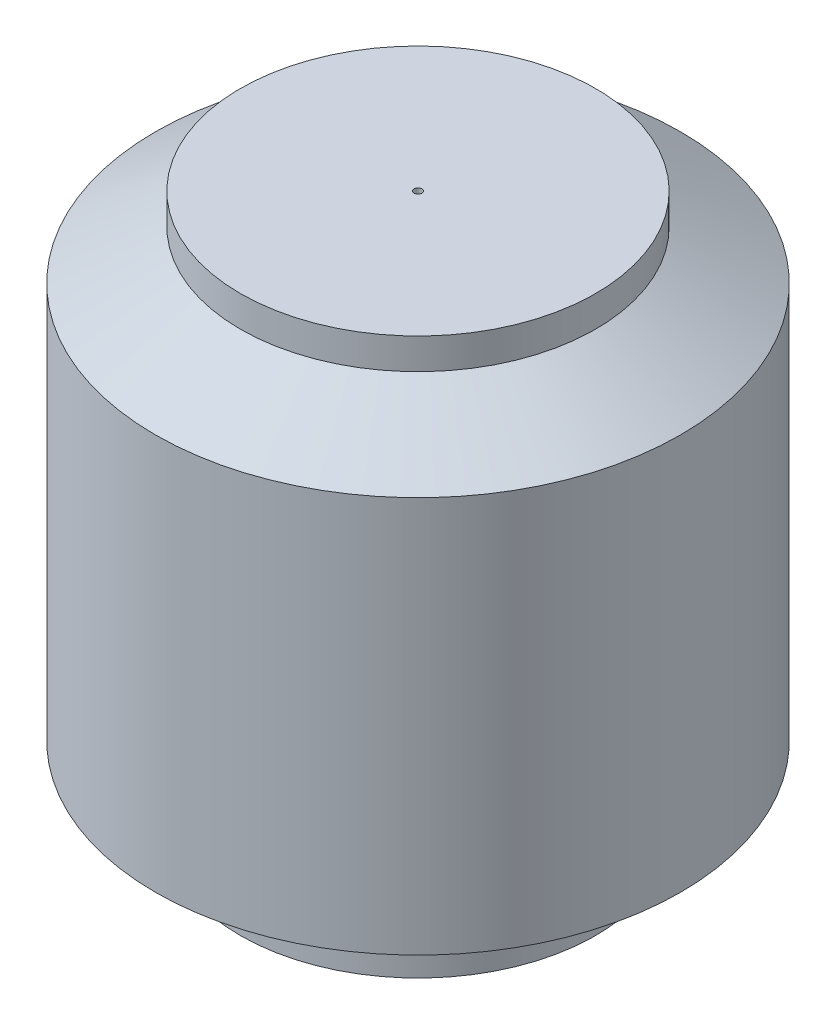
ISO-10303-21;
HEADER;
FILE_DESCRIPTION(('STEP AP214'),'2;1');
FILE_NAME('part.step','',(''),(''),'','','');
FILE_SCHEMA(('AUTOMOTIVE_DESIGN { 1 0 10303 214 1 1 1 1 }'));
ENDSEC;
DATA;
#1=APPLICATION_CONTEXT('core data for automotive mechanical design processes');
#2=APPLICATION_PROTOCOL_DEFINITION('international standard','automotive_design',2000,#1);
#3=PRODUCT_CONTEXT('',#1,'mechanical');
#4=PRODUCT('Part','Part','',(#3));
#5=PRODUCT_RELATED_PRODUCT_CATEGORY('part','',(#4));
#6=PRODUCT_DEFINITION_FORMATION('','',#4);
#7=PRODUCT_DEFINITION_CONTEXT('part definition',#1,'design');
#8=PRODUCT_DEFINITION('design','',#6,#7);
#9=PRODUCT_DEFINITION_SHAPE('','',#8);
#10=(LENGTH_UNIT() NAMED_UNIT(*) SI_UNIT(.MILLI.,.METRE.));
#11=(NAMED_UNIT(*) PLANE_ANGLE_UNIT() SI_UNIT($,.RADIAN.));
#12=(NAMED_UNIT(*) SI_UNIT($,.STERADIAN.) SOLID_ANGLE_UNIT());
#13=UNCERTAINTY_MEASURE_WITH_UNIT(LENGTH_MEASURE(1.E-05),#10,'distance_accuracy_value','');
#14=(GEOMETRIC_REPRESENTATION_CONTEXT(3) GLOBAL_UNCERTAINTY_ASSIGNED_CONTEXT((#13)) GLOBAL_UNIT_ASSIGNED_CONTEXT((#10,
#11,#12)) REPRESENTATION_CONTEXT('',''));
#15=CARTESIAN_POINT('',(0.,0.,0.));
#16=DIRECTION('',(0.,0.,1.));
#17=DIRECTION('',(1.,0.,0.));
#18=AXIS2_PLACEMENT_3D('',#15,#16,#17);
#19=CARTESIAN_POINT('',(0.,0.,0.));
#20=DIRECTION('',(0.,1.,0.));
#21=DIRECTION('',(0.,0.,1.));
#22=AXIS2_PLACEMENT_3D('',#19,#20,#21);
#23=PLANE('',#22);
#24=CARTESIAN_POINT('',(0.,0.,0.));
#25=DIRECTION('',(0.,1.,0.));
#26=DIRECTION('',(0.,0.,1.));
#27=AXIS2_PLACEMENT_3D('',#24,#25,#26);
#28=CIRCLE('',#27,1.25);
#29=CARTESIAN_POINT('',(0.,0.,1.25));
#30=VERTEX_POINT('',#29);
#31=EDGE_CURVE('E62',#30,#30,#28,.T.);
#32=ORIENTED_EDGE('',*,*,#31,.F.);
#33=EDGE_LOOP('',(#32));
#34=FACE_BOUND('',#33,.T.);
#35=CARTESIAN_POINT('',(0.,0.,0.));
#36=DIRECTION('',(0.,1.,0.));
#37=DIRECTION('',(0.,0.,1.));
#38=AXIS2_PLACEMENT_3D('',#35,#36,#37);
#39=CIRCLE('',#38,57.5);
#40=CARTESIAN_POINT('',(0.,0.,57.5));
#41=VERTEX_POINT('',#40);
#42=EDGE_CURVE('E41',#41,#41,#39,.T.);
#43=ORIENTED_EDGE('',*,*,#42,.T.);
#44=EDGE_LOOP('',(#43));
#45=FACE_BOUND('',#44,.T.);
#46=ADVANCED_FACE('F30',(#34,#45),#23,.T.);
#47=CARTESIAN_POINT('',(0.,52.509012345679,0.));
#48=DIRECTION('',(0.,1.,0.));
#49=DIRECTION('',(0.,0.,1.));
#50=AXIS2_PLACEMENT_3D('',#47,#48,#49);
#51=CYLINDRICAL_SURFACE('',#50,57.5);
#52=CARTESIAN_POINT('',(0.,-9.99999999999997,0.));
#53=DIRECTION('',(0.,1.,0.));
#54=DIRECTION('',(0.,0.,1.));
#55=AXIS2_PLACEMENT_3D('',#52,#53,#54);
#56=CIRCLE('',#55,57.5);
#57=CARTESIAN_POINT('',(0.,-9.99999999999997,57.5));
#58=VERTEX_POINT('',#57);
#59=EDGE_CURVE('E45',#58,#58,#56,.T.);
#60=ORIENTED_EDGE('',*,*,#59,.T.);
#61=EDGE_LOOP('',(#60));
#62=FACE_BOUND('',#61,.T.);
#63=ORIENTED_EDGE('',*,*,#42,.F.);
#64=EDGE_LOOP('',(#63));
#65=FACE_BOUND('',#64,.T.);
#66=ADVANCED_FACE('F70',(#62,#65),#51,.T.);
#67=CARTESIAN_POINT('',(0.,-9.99999999999997,0.));
#68=DIRECTION('',(0.,-1.,0.));
#69=DIRECTION('',(0.,0.,-1.));
#70=AXIS2_PLACEMENT_3D('',#67,#68,#69);
#71=CONICAL_SURFACE('',#70,57.5,1.0471975511966);
#72=CARTESIAN_POINT('',(0.,-25.8771324027146,0.));
#73=DIRECTION('',(0.,1.,0.));
#74=DIRECTION('',(0.,0.,1.));
#75=AXIS2_PLACEMENT_3D('',#72,#73,#74);
#76=CIRCLE('',#75,85.);
#77=CARTESIAN_POINT('',(0.,-25.8771324027146,85.));
#78=VERTEX_POINT('',#77);
#79=EDGE_CURVE('E50',#78,#78,#76,.T.);
#80=ORIENTED_EDGE('',*,*,#79,.T.);
#81=EDGE_LOOP('',(#80));
#82=FACE_BOUND('',#81,.T.);
#83=ORIENTED_EDGE('',*,*,#59,.F.);
#84=EDGE_LOOP('',(#83));
#85=FACE_BOUND('',#84,.T.);
#86=ADVANCED_FACE('F74',(#82,#85),#71,.T.);
#87=CARTESIAN_POINT('',(0.,52.509012345679,0.));
#88=DIRECTION('',(0.,1.,0.));
#89=DIRECTION('',(0.,0.,1.));
#90=AXIS2_PLACEMENT_3D('',#87,#88,#89);
#91=CYLINDRICAL_SURFACE('',#90,85.);
#92=CARTESIAN_POINT('',(0.,-154.122867597285,0.));
#93=DIRECTION('',(0.,1.,0.));
#94=DIRECTION('',(0.,0.,1.));
#95=AXIS2_PLACEMENT_3D('',#92,#93,#94);
#96=CIRCLE('',#95,85.);
#97=CARTESIAN_POINT('',(0.,-154.122867597285,85.));
#98=VERTEX_POINT('',#97);
#99=EDGE_CURVE('E53',#98,#98,#96,.T.);
#100=ORIENTED_EDGE('',*,*,#99,.T.);
#101=EDGE_LOOP('',(#100));
#102=FACE_BOUND('',#101,.T.);
#103=ORIENTED_EDGE('',*,*,#79,.F.);
#104=EDGE_LOOP('',(#103));
#105=FACE_BOUND('',#104,.T.);
#106=ADVANCED_FACE('F80',(#102,#105),#91,.T.);
#107=CARTESIAN_POINT('',(0.,-154.122867597285,0.));
#108=DIRECTION('',(0.,1.,0.));
#109=DIRECTION('',(0.,0.,1.));
#110=AXIS2_PLACEMENT_3D('',#107,#108,#109);
#111=CONICAL_SURFACE('',#110,85.,1.0471975511966);
#112=CARTESIAN_POINT('',(0.,-170.,0.));
#113=DIRECTION('',(0.,1.,0.));
#114=DIRECTION('',(0.,0.,1.));
#115=AXIS2_PLACEMENT_3D('',#112,#113,#114);
#116=CIRCLE('',#115,57.5);
#117=CARTESIAN_POINT('',(0.,-170.,57.5));
#118=VERTEX_POINT('',#117);
#119=EDGE_CURVE('E56',#118,#118,#116,.T.);
#120=ORIENTED_EDGE('',*,*,#119,.T.);
#121=EDGE_LOOP('',(#120));
#122=FACE_BOUND('',#121,.T.);
#123=ORIENTED_EDGE('',*,*,#99,.F.);
#124=EDGE_LOOP('',(#123));
#125=FACE_BOUND('',#124,.T.);
#126=ADVANCED_FACE('F86',(#122,#125),#111,.T.);
#127=CARTESIAN_POINT('',(0.,52.509012345679,0.));
#128=DIRECTION('',(0.,1.,0.));
#129=DIRECTION('',(0.,0.,1.));
#130=AXIS2_PLACEMENT_3D('',#127,#128,#129);
#131=CYLINDRICAL_SURFACE('',#130,57.5);
#132=CARTESIAN_POINT('',(0.,-180.,0.));
#133=DIRECTION('',(0.,1.,0.));
#134=DIRECTION('',(0.,0.,1.));
#135=AXIS2_PLACEMENT_3D('',#132,#133,#134);
#136=CIRCLE('',#135,57.5);
#137=CARTESIAN_POINT('',(0.,-180.,57.5));
#138=VERTEX_POINT('',#137);
#139=EDGE_CURVE('E59',#138,#138,#136,.T.);
#140=ORIENTED_EDGE('',*,*,#139,.T.);
#141=EDGE_LOOP('',(#140));
#142=FACE_BOUND('',#141,.T.);
#143=ORIENTED_EDGE('',*,*,#119,.F.);
#144=EDGE_LOOP('',(#143));
#145=FACE_BOUND('',#144,.T.);
#146=ADVANCED_FACE('F90',(#142,#145),#131,.T.);
#147=CARTESIAN_POINT('',(-57.5,-180.,0.));
#148=DIRECTION('',(0.,-1.,0.));
#149=DIRECTION('',(0.,0.,-1.));
#150=AXIS2_PLACEMENT_3D('',#147,#148,#149);
#151=PLANE('',#150);
#152=CARTESIAN_POINT('',(0.,-180.,0.));
#153=DIRECTION('',(0.,-1.,0.));
#154=DIRECTION('',(0.,0.,-1.));
#155=AXIS2_PLACEMENT_3D('',#152,#153,#154);
#156=CIRCLE('',#155,3.24999999999984);
#157=CARTESIAN_POINT('',(0.,-180.,-3.24999999999984));
#158=VERTEX_POINT('',#157);
#159=EDGE_CURVE('E37',#158,#158,#156,.F.);
#160=ORIENTED_EDGE('',*,*,#159,.T.);
#161=EDGE_LOOP('',(#160));
#162=FACE_BOUND('',#161,.T.);
#163=ORIENTED_EDGE('',*,*,#139,.F.);
#164=EDGE_LOOP('',(#163));
#165=FACE_BOUND('',#164,.T.);
#166=ADVANCED_FACE('F94',(#162,#165),#151,.T.);
#167=CARTESIAN_POINT('',(0.,-180.,0.));
#168=DIRECTION('',(0.,1.,0.));
#169=DIRECTION('',(0.,0.,1.));
#170=AXIS2_PLACEMENT_3D('',#167,#168,#169);
#171=CYLINDRICAL_SURFACE('',#170,1.25);
#172=CARTESIAN_POINT('',(0.,-178.,0.));
#173=DIRECTION('',(0.,-1.,0.));
#174=DIRECTION('',(0.,0.,-1.));
#175=AXIS2_PLACEMENT_3D('',#172,#173,#174);
#176=CIRCLE('',#175,1.25);
#177=CARTESIAN_POINT('',(0.,-178.,1.25));
#178=VERTEX_POINT('',#177);
#179=EDGE_CURVE('E10',#178,#178,#176,.T.);
#180=CARTESIAN_POINT('',(0.,-178.,1.25));
#181=CARTESIAN_POINT('',(0.,-176.145833333333,1.25));
#182=CARTESIAN_POINT('',(0.,-174.291666666667,1.25));
#183=CARTESIAN_POINT('',(0.,-170.583333333333,1.25));
#184=CARTESIAN_POINT('',(0.,-168.729166666667,1.25));
#185=CARTESIAN_POINT('',(0.,-165.020833333333,1.25));
#186=CARTESIAN_POINT('',(0.,-163.166666666667,1.25));
#187=CARTESIAN_POINT('',(0.,-159.458333333333,1.25));
#188=CARTESIAN_POINT('',(0.,-157.604166666667,1.25));
#189=CARTESIAN_POINT('',(0.,-153.895833333333,1.25));
#190=CARTESIAN_POINT('',(0.,-152.041666666667,1.25));
#191=CARTESIAN_POINT('',(0.,-148.333333333333,1.25));
#192=CARTESIAN_POINT('',(0.,-146.479166666667,1.25));
#193=CARTESIAN_POINT('',(0.,-142.770833333333,1.25));
#194=CARTESIAN_POINT('',(0.,-140.916666666667,1.25));
#195=CARTESIAN_POINT('',(0.,-137.208333333333,1.25));
#196=CARTESIAN_POINT('',(0.,-135.354166666667,1.25));
#197=CARTESIAN_POINT('',(0.,-131.645833333333,1.25));
#198=CARTESIAN_POINT('',(0.,-129.791666666667,1.25));
#199=CARTESIAN_POINT('',(0.,-126.083333333333,1.25));
#200=CARTESIAN_POINT('',(0.,-124.229166666667,1.25));
#201=CARTESIAN_POINT('',(0.,-120.520833333333,1.25));
#202=CARTESIAN_POINT('',(0.,-118.666666666667,1.25));
#203=CARTESIAN_POINT('',(0.,-114.958333333333,1.25));
#204=CARTESIAN_POINT('',(0.,-113.104166666667,1.25));
#205=CARTESIAN_POINT('',(0.,-109.395833333333,1.25));
#206=CARTESIAN_POINT('',(0.,-107.541666666667,1.25));
#207=CARTESIAN_POINT('',(0.,-103.833333333333,1.25));
#208=CARTESIAN_POINT('',(0.,-101.979166666667,1.25));
#209=CARTESIAN_POINT('',(0.,-98.2708333333334,1.25));
#210=CARTESIAN_POINT('',(0.,-96.4166666666667,1.25));
#211=CARTESIAN_POINT('',(0.,-92.7083333333334,1.25));
#212=CARTESIAN_POINT('',(0.,-90.8541666666667,1.25));
#213=CARTESIAN_POINT('',(0.,-87.1458333333334,1.25));
#214=CARTESIAN_POINT('',(0.,-85.2916666666667,1.25));
#215=CARTESIAN_POINT('',(0.,-81.5833333333334,1.25));
#216=CARTESIAN_POINT('',(0.,-79.7291666666667,1.25));
#217=CARTESIAN_POINT('',(0.,-76.0208333333334,1.25));
#218=CARTESIAN_POINT('',(0.,-74.1666666666667,1.25));
#219=CARTESIAN_POINT('',(0.,-70.4583333333334,1.25));
#220=CARTESIAN_POINT('',(0.,-68.6041666666667,1.25));
#221=CARTESIAN_POINT('',(0.,-64.8958333333333,1.25));
#222=CARTESIAN_POINT('',(0.,-63.0416666666667,1.25));
#223=CARTESIAN_POINT('',(0.,-59.3333333333333,1.25));
#224=CARTESIAN_POINT('',(0.,-57.4791666666667,1.25));
#225=CARTESIAN_POINT('',(0.,-53.7708333333333,1.25));
#226=CARTESIAN_POINT('',(0.,-51.9166666666667,1.25));
#227=CARTESIAN_POINT('',(0.,-48.2083333333333,1.25));
#228=CARTESIAN_POINT('',(0.,-46.3541666666667,1.25));
#229=CARTESIAN_POINT('',(0.,-42.6458333333333,1.25));
#230=CARTESIAN_POINT('',(0.,-40.7916666666667,1.25));
#231=CARTESIAN_POINT('',(0.,-37.0833333333333,1.25));
#232=CARTESIAN_POINT('',(0.,-35.2291666666667,1.25));
#233=CARTESIAN_POINT('',(0.,-31.5208333333333,1.25));
#234=CARTESIAN_POINT('',(0.,-29.6666666666667,1.25));
#235=CARTESIAN_POINT('',(0.,-25.9583333333333,1.25));
#236=CARTESIAN_POINT('',(0.,-24.1041666666667,1.25));
#237=CARTESIAN_POINT('',(0.,-20.3958333333333,1.25));
#238=CARTESIAN_POINT('',(0.,-18.5416666666667,1.25));
#239=CARTESIAN_POINT('',(0.,-14.8333333333333,1.25));
#240=CARTESIAN_POINT('',(0.,-12.9791666666666,1.25));
#241=CARTESIAN_POINT('',(0.,-9.2708333333333,1.25));
#242=CARTESIAN_POINT('',(0.,-7.41666666666664,1.25));
#243=CARTESIAN_POINT('',(0.,-3.7083333333333,1.25));
#244=CARTESIAN_POINT('',(0.,-1.85416666666664,1.25));
#245=CARTESIAN_POINT('',(0.,0.,1.25));
#246=B_SPLINE_CURVE_WITH_KNOTS('',3,(#180,#181,#182,#183,#184,#185,#186,#187,#188,#189,#190,
#191,#192,#193,#194,#195,#196,#197,#198,#199,#200,#201,#202,#203,#204,#205,#206,#207,#208,#209,
#210,#211,#212,#213,#214,#215,#216,#217,#218,#219,#220,#221,#222,#223,#224,#225,#226,#227,#228,
#229,#230,#231,#232,#233,#234,#235,#236,#237,#238,#239,#240,#241,#242,#243,#244,#245),
.UNSPECIFIED.,.F.,.F.,(4,2,2,2,2,2,2,2,2,2,2,2,2,2,2,2,2,2,2,2,2,2,2,2,2,2,2,2,2,2,2,2,4),(0.,
5.5625,11.125,16.6875,22.25,27.8125,33.375,38.9375,44.5,50.0625,55.625,61.1875,66.75,72.3125,
77.875,83.4375,89.,94.5625,100.125,105.6875,111.25,116.8125,122.375,127.9375,133.5,139.0625,
144.625,150.1875,155.75,161.3125,166.875,172.4375,178.),.UNSPECIFIED.);
#247=EDGE_CURVE('BSEAM66',#178,#30,#246,.T.);
#248=ORIENTED_EDGE('',*,*,#179,.T.);
#249=ORIENTED_EDGE('',*,*,#31,.T.);
#250=ORIENTED_EDGE('',*,*,#247,.T.);
#251=ORIENTED_EDGE('',*,*,#247,.F.);
#252=EDGE_LOOP('',(#248,#250,#249,#251));
#253=FACE_BOUND('',#252,.T.);
#254=ADVANCED_FACE('F66',(#253),#171,.F.);
#255=CARTESIAN_POINT('',(0.,-180.,0.));
#256=DIRECTION('',(0.,-1.,0.));
#257=DIRECTION('',(0.,0.,-1.));
#258=AXIS2_PLACEMENT_3D('',#255,#256,#257);
#259=CONICAL_SURFACE('',#258,3.24999999999984,0.785398163397442);
#260=ORIENTED_EDGE('',*,*,#179,.F.);
#261=EDGE_LOOP('',(#260));
#262=FACE_BOUND('',#261,.T.);
#263=ORIENTED_EDGE('',*,*,#159,.F.);
#264=EDGE_LOOP('',(#263));
#265=FACE_BOUND('',#264,.T.);
#266=ADVANCED_FACE('F32',(#262,#265),#259,.F.);
#267=CLOSED_SHELL('',(#46,#66,#86,#106,#126,#146,#166,#254,#266));
#268=MANIFOLD_SOLID_BREP('B2',#267);
#269=ADVANCED_BREP_SHAPE_REPRESENTATION('',(#18,#268),#14);
#270=SHAPE_DEFINITION_REPRESENTATION(#9,#269);
ENDSEC;
END-ISO-10303-21;
